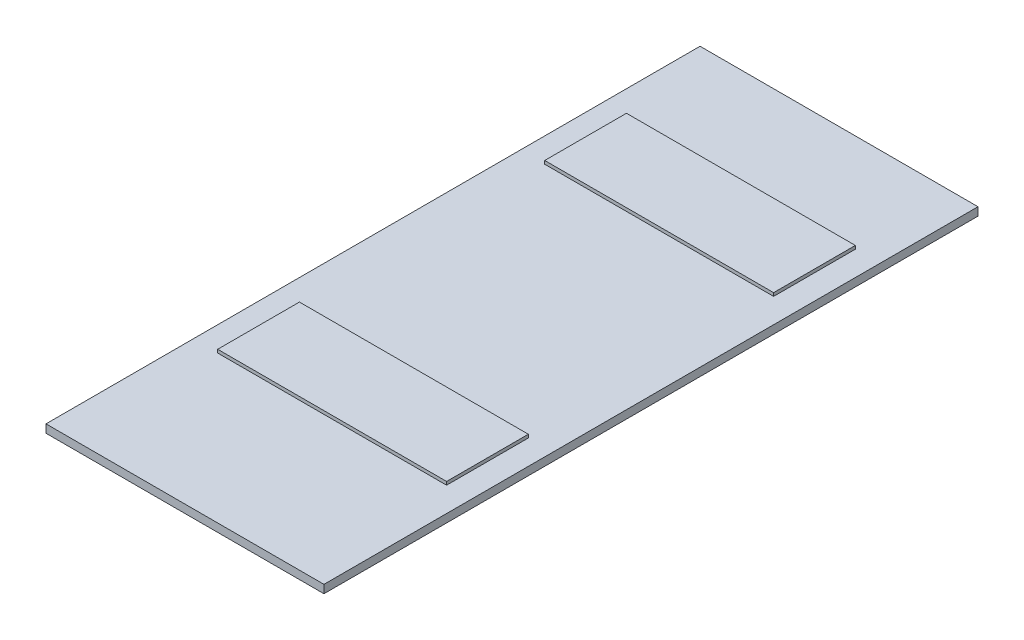
ISO-10303-21;
HEADER;
FILE_DESCRIPTION(('STEP AP214'),'2;1');
FILE_NAME('part.step','',(''),(''),'','','');
FILE_SCHEMA(('AUTOMOTIVE_DESIGN { 1 0 10303 214 1 1 1 1 }'));
ENDSEC;
DATA;
#1=APPLICATION_CONTEXT('core data for automotive mechanical design processes');
#2=APPLICATION_PROTOCOL_DEFINITION('international standard','automotive_design',2000,#1);
#3=PRODUCT_CONTEXT('',#1,'mechanical');
#4=PRODUCT('Part','Part','',(#3));
#5=PRODUCT_RELATED_PRODUCT_CATEGORY('part','',(#4));
#6=PRODUCT_DEFINITION_FORMATION('','',#4);
#7=PRODUCT_DEFINITION_CONTEXT('part definition',#1,'design');
#8=PRODUCT_DEFINITION('design','',#6,#7);
#9=PRODUCT_DEFINITION_SHAPE('','',#8);
#10=(LENGTH_UNIT() NAMED_UNIT(*) SI_UNIT(.MILLI.,.METRE.));
#11=(NAMED_UNIT(*) PLANE_ANGLE_UNIT() SI_UNIT($,.RADIAN.));
#12=(NAMED_UNIT(*) SI_UNIT($,.STERADIAN.) SOLID_ANGLE_UNIT());
#13=UNCERTAINTY_MEASURE_WITH_UNIT(LENGTH_MEASURE(1.E-05),#10,'distance_accuracy_value','');
#14=(GEOMETRIC_REPRESENTATION_CONTEXT(3) GLOBAL_UNCERTAINTY_ASSIGNED_CONTEXT((#13)) GLOBAL_UNIT_ASSIGNED_CONTEXT((#10,
#11,#12)) REPRESENTATION_CONTEXT('',''));
#15=CARTESIAN_POINT('',(0.,0.,0.));
#16=DIRECTION('',(0.,0.,1.));
#17=DIRECTION('',(1.,0.,0.));
#18=AXIS2_PLACEMENT_3D('',#15,#16,#17);
#19=CARTESIAN_POINT('',(0.,2.5,0.));
#20=DIRECTION('',(0.,-1.,0.));
#21=DIRECTION('',(0.,0.,-1.));
#22=AXIS2_PLACEMENT_3D('',#19,#20,#21);
#23=PLANE('',#22);
#24=DIRECTION('',(0.,0.,1.));
#25=VECTOR('',#24,1.);
#26=CARTESIAN_POINT('',(7.5,2.5,-170.));
#27=LINE('',#26,#25);
#28=CARTESIAN_POINT('',(7.5,2.5,-170.));
#29=VERTEX_POINT('',#28);
#30=CARTESIAN_POINT('',(7.5,2.5,-145.));
#31=VERTEX_POINT('',#30);
#32=EDGE_CURVE('E142',#29,#31,#27,.T.);
#33=ORIENTED_EDGE('',*,*,#32,.F.);
#34=DIRECTION('',(-1.,0.,0.));
#35=VECTOR('',#34,1.);
#36=CARTESIAN_POINT('',(7.5,2.5,-170.));
#37=LINE('',#36,#35);
#38=CARTESIAN_POINT('',(77.5,2.5,-170.));
#39=VERTEX_POINT('',#38);
#40=EDGE_CURVE('E155',#39,#29,#37,.T.);
#41=ORIENTED_EDGE('',*,*,#40,.F.);
#42=DIRECTION('',(0.,0.,-1.));
#43=VECTOR('',#42,1.);
#44=CARTESIAN_POINT('',(77.5,2.5,-170.));
#45=LINE('',#44,#43);
#46=CARTESIAN_POINT('',(77.5,2.5,-145.));
#47=VERTEX_POINT('',#46);
#48=EDGE_CURVE('E164',#47,#39,#45,.T.);
#49=ORIENTED_EDGE('',*,*,#48,.F.);
#50=DIRECTION('',(1.,0.,0.));
#51=VECTOR('',#50,1.);
#52=CARTESIAN_POINT('',(77.5,2.5,-145.));
#53=LINE('',#52,#51);
#54=EDGE_CURVE('E145',#31,#47,#53,.T.);
#55=ORIENTED_EDGE('',*,*,#54,.F.);
#56=EDGE_LOOP('',(#33,#41,#49,#55));
#57=FACE_BOUND('',#56,.T.);
#58=DIRECTION('',(0.,0.,1.));
#59=VECTOR('',#58,1.);
#60=CARTESIAN_POINT('',(0.,2.5,0.));
#61=LINE('',#60,#59);
#62=CARTESIAN_POINT('',(0.,2.5,-200.));
#63=VERTEX_POINT('',#62);
#64=CARTESIAN_POINT('',(0.,2.5,0.));
#65=VERTEX_POINT('',#64);
#66=EDGE_CURVE('E181',#63,#65,#61,.T.);
#67=ORIENTED_EDGE('',*,*,#66,.T.);
#68=DIRECTION('',(1.,0.,0.));
#69=VECTOR('',#68,1.);
#70=CARTESIAN_POINT('',(0.,2.5,0.));
#71=LINE('',#70,#69);
#72=CARTESIAN_POINT('',(85.,2.5,0.));
#73=VERTEX_POINT('',#72);
#74=EDGE_CURVE('E184',#65,#73,#71,.T.);
#75=ORIENTED_EDGE('',*,*,#74,.T.);
#76=DIRECTION('',(0.,0.,-1.));
#77=VECTOR('',#76,1.);
#78=CARTESIAN_POINT('',(85.,2.5,0.));
#79=LINE('',#78,#77);
#80=CARTESIAN_POINT('',(85.,2.5,-200.));
#81=VERTEX_POINT('',#80);
#82=EDGE_CURVE('E187',#73,#81,#79,.T.);
#83=ORIENTED_EDGE('',*,*,#82,.T.);
#84=DIRECTION('',(-1.,0.,0.));
#85=VECTOR('',#84,1.);
#86=CARTESIAN_POINT('',(0.,2.5,-200.));
#87=LINE('',#86,#85);
#88=EDGE_CURVE('E189',#81,#63,#87,.T.);
#89=ORIENTED_EDGE('',*,*,#88,.T.);
#90=EDGE_LOOP('',(#67,#75,#83,#89));
#91=FACE_BOUND('',#90,.T.);
#92=DIRECTION('',(0.,0.,1.));
#93=VECTOR('',#92,1.);
#94=CARTESIAN_POINT('',(7.5,2.5,-70.));
#95=LINE('',#94,#93);
#96=CARTESIAN_POINT('',(7.5,2.5,-70.));
#97=VERTEX_POINT('',#96);
#98=CARTESIAN_POINT('',(7.50000000000001,2.5,-45.));
#99=VERTEX_POINT('',#98);
#100=EDGE_CURVE('E141',#97,#99,#95,.T.);
#101=ORIENTED_EDGE('',*,*,#100,.F.);
#102=DIRECTION('',(-1.,0.,0.));
#103=VECTOR('',#102,1.);
#104=CARTESIAN_POINT('',(7.5,2.5,-70.));
#105=LINE('',#104,#103);
#106=CARTESIAN_POINT('',(77.5,2.5,-70.));
#107=VERTEX_POINT('',#106);
#108=EDGE_CURVE('E138',#107,#97,#105,.T.);
#109=ORIENTED_EDGE('',*,*,#108,.F.);
#110=DIRECTION('',(0.,0.,-1.));
#111=VECTOR('',#110,1.);
#112=CARTESIAN_POINT('',(77.5,2.5,-70.));
#113=LINE('',#112,#111);
#114=CARTESIAN_POINT('',(77.5,2.5,-45.));
#115=VERTEX_POINT('',#114);
#116=EDGE_CURVE('E52',#115,#107,#113,.T.);
#117=ORIENTED_EDGE('',*,*,#116,.F.);
#118=DIRECTION('',(1.,0.,0.));
#119=VECTOR('',#118,1.);
#120=CARTESIAN_POINT('',(77.5,2.5,-45.));
#121=LINE('',#120,#119);
#122=EDGE_CURVE('E47',#99,#115,#121,.T.);
#123=ORIENTED_EDGE('',*,*,#122,.F.);
#124=EDGE_LOOP('',(#101,#109,#117,#123));
#125=FACE_BOUND('',#124,.T.);
#126=ADVANCED_FACE('F32',(#57,#91,#125),#23,.F.);
#127=CARTESIAN_POINT('',(0.,2.5,0.));
#128=DIRECTION('',(1.,0.,0.));
#129=DIRECTION('',(0.,0.,-1.));
#130=AXIS2_PLACEMENT_3D('',#127,#128,#129);
#131=PLANE('',#130);
#132=DIRECTION('',(0.,0.,1.));
#133=VECTOR('',#132,1.);
#134=CARTESIAN_POINT('',(0.,0.,0.));
#135=LINE('',#134,#133);
#136=CARTESIAN_POINT('',(0.,0.,-200.));
#137=VERTEX_POINT('',#136);
#138=CARTESIAN_POINT('',(0.,0.,0.));
#139=VERTEX_POINT('',#138);
#140=EDGE_CURVE('E180',#137,#139,#135,.T.);
#141=ORIENTED_EDGE('',*,*,#140,.T.);
#142=DIRECTION('',(0.,-1.,0.));
#143=VECTOR('',#142,1.);
#144=CARTESIAN_POINT('',(0.,2.5,0.));
#145=LINE('',#144,#143);
#146=EDGE_CURVE('E11',#65,#139,#145,.T.);
#147=ORIENTED_EDGE('',*,*,#146,.F.);
#148=ORIENTED_EDGE('',*,*,#66,.F.);
#149=DIRECTION('',(0.,-1.,0.));
#150=VECTOR('',#149,1.);
#151=CARTESIAN_POINT('',(0.,2.5,-200.));
#152=LINE('',#151,#150);
#153=EDGE_CURVE('E191',#63,#137,#152,.T.);
#154=ORIENTED_EDGE('',*,*,#153,.T.);
#155=EDGE_LOOP('',(#141,#147,#148,#154));
#156=FACE_BOUND('',#155,.T.);
#157=ADVANCED_FACE('F34',(#156),#131,.F.);
#158=CARTESIAN_POINT('',(0.,2.5,0.));
#159=DIRECTION('',(0.,0.,-1.));
#160=DIRECTION('',(-1.,0.,0.));
#161=AXIS2_PLACEMENT_3D('',#158,#159,#160);
#162=PLANE('',#161);
#163=DIRECTION('',(1.,0.,0.));
#164=VECTOR('',#163,1.);
#165=CARTESIAN_POINT('',(0.,0.,0.));
#166=LINE('',#165,#164);
#167=CARTESIAN_POINT('',(85.,0.,0.));
#168=VERTEX_POINT('',#167);
#169=EDGE_CURVE('E194',#139,#168,#166,.T.);
#170=ORIENTED_EDGE('',*,*,#169,.T.);
#171=DIRECTION('',(0.,-1.,0.));
#172=VECTOR('',#171,1.);
#173=CARTESIAN_POINT('',(85.,2.5,0.));
#174=LINE('',#173,#172);
#175=EDGE_CURVE('E40',#73,#168,#174,.T.);
#176=ORIENTED_EDGE('',*,*,#175,.F.);
#177=ORIENTED_EDGE('',*,*,#74,.F.);
#178=ORIENTED_EDGE('',*,*,#146,.T.);
#179=EDGE_LOOP('',(#170,#176,#177,#178));
#180=FACE_BOUND('',#179,.T.);
#181=ADVANCED_FACE('F223',(#180),#162,.F.);
#182=CARTESIAN_POINT('',(85.,2.5,0.));
#183=DIRECTION('',(-1.,0.,0.));
#184=DIRECTION('',(0.,0.,1.));
#185=AXIS2_PLACEMENT_3D('',#182,#183,#184);
#186=PLANE('',#185);
#187=DIRECTION('',(0.,0.,-1.));
#188=VECTOR('',#187,1.);
#189=CARTESIAN_POINT('',(85.,0.,0.));
#190=LINE('',#189,#188);
#191=CARTESIAN_POINT('',(85.,0.,-200.));
#192=VERTEX_POINT('',#191);
#193=EDGE_CURVE('E196',#168,#192,#190,.T.);
#194=ORIENTED_EDGE('',*,*,#193,.T.);
#195=DIRECTION('',(0.,-1.,0.));
#196=VECTOR('',#195,1.);
#197=CARTESIAN_POINT('',(85.,2.5,-200.));
#198=LINE('',#197,#196);
#199=EDGE_CURVE('E201',#81,#192,#198,.T.);
#200=ORIENTED_EDGE('',*,*,#199,.F.);
#201=ORIENTED_EDGE('',*,*,#82,.F.);
#202=ORIENTED_EDGE('',*,*,#175,.T.);
#203=EDGE_LOOP('',(#194,#200,#201,#202));
#204=FACE_BOUND('',#203,.T.);
#205=ADVANCED_FACE('F208',(#204),#186,.F.);
#206=CARTESIAN_POINT('',(0.,2.5,-200.));
#207=DIRECTION('',(0.,0.,1.));
#208=DIRECTION('',(1.,0.,0.));
#209=AXIS2_PLACEMENT_3D('',#206,#207,#208);
#210=PLANE('',#209);
#211=DIRECTION('',(-1.,0.,0.));
#212=VECTOR('',#211,1.);
#213=CARTESIAN_POINT('',(0.,0.,-200.));
#214=LINE('',#213,#212);
#215=EDGE_CURVE('E185',#192,#137,#214,.T.);
#216=ORIENTED_EDGE('',*,*,#215,.T.);
#217=ORIENTED_EDGE('',*,*,#153,.F.);
#218=ORIENTED_EDGE('',*,*,#88,.F.);
#219=ORIENTED_EDGE('',*,*,#199,.T.);
#220=EDGE_LOOP('',(#216,#217,#218,#219));
#221=FACE_BOUND('',#220,.T.);
#222=ADVANCED_FACE('F217',(#221),#210,.F.);
#223=CARTESIAN_POINT('',(0.,0.,0.));
#224=DIRECTION('',(0.,-1.,0.));
#225=DIRECTION('',(0.,0.,-1.));
#226=AXIS2_PLACEMENT_3D('',#223,#224,#225);
#227=PLANE('',#226);
#228=ORIENTED_EDGE('',*,*,#140,.F.);
#229=ORIENTED_EDGE('',*,*,#215,.F.);
#230=ORIENTED_EDGE('',*,*,#193,.F.);
#231=ORIENTED_EDGE('',*,*,#169,.F.);
#232=EDGE_LOOP('',(#228,#229,#230,#231));
#233=FACE_BOUND('',#232,.T.);
#234=ADVANCED_FACE('F214',(#233),#227,.T.);
#235=CARTESIAN_POINT('',(7.5,3.5,-170.));
#236=DIRECTION('',(1.,0.,0.));
#237=DIRECTION('',(0.,0.,-1.));
#238=AXIS2_PLACEMENT_3D('',#235,#236,#237);
#239=PLANE('',#238);
#240=ORIENTED_EDGE('',*,*,#32,.T.);
#241=DIRECTION('',(0.,-1.,0.));
#242=VECTOR('',#241,1.);
#243=CARTESIAN_POINT('',(7.5,3.5,-145.));
#244=LINE('',#243,#242);
#245=CARTESIAN_POINT('',(7.5,3.5,-145.));
#246=VERTEX_POINT('',#245);
#247=EDGE_CURVE('E177',#246,#31,#244,.T.);
#248=ORIENTED_EDGE('',*,*,#247,.F.);
#249=DIRECTION('',(0.,0.,1.));
#250=VECTOR('',#249,1.);
#251=CARTESIAN_POINT('',(7.5,3.5,-170.));
#252=LINE('',#251,#250);
#253=CARTESIAN_POINT('',(7.5,3.5,-170.));
#254=VERTEX_POINT('',#253);
#255=EDGE_CURVE('E151',#254,#246,#252,.T.);
#256=ORIENTED_EDGE('',*,*,#255,.F.);
#257=DIRECTION('',(0.,-1.,0.));
#258=VECTOR('',#257,1.);
#259=CARTESIAN_POINT('',(7.5,3.5,-170.));
#260=LINE('',#259,#258);
#261=EDGE_CURVE('E160',#254,#29,#260,.T.);
#262=ORIENTED_EDGE('',*,*,#261,.T.);
#263=EDGE_LOOP('',(#240,#248,#256,#262));
#264=FACE_BOUND('',#263,.T.);
#265=ADVANCED_FACE('F237',(#264),#239,.F.);
#266=CARTESIAN_POINT('',(77.5,3.5,-145.));
#267=DIRECTION('',(0.,0.,-1.));
#268=DIRECTION('',(-1.,0.,0.));
#269=AXIS2_PLACEMENT_3D('',#266,#267,#268);
#270=PLANE('',#269);
#271=ORIENTED_EDGE('',*,*,#54,.T.);
#272=DIRECTION('',(0.,-1.,0.));
#273=VECTOR('',#272,1.);
#274=CARTESIAN_POINT('',(77.5,3.5,-145.));
#275=LINE('',#274,#273);
#276=CARTESIAN_POINT('',(77.5,3.5,-145.));
#277=VERTEX_POINT('',#276);
#278=EDGE_CURVE('E174',#277,#47,#275,.T.);
#279=ORIENTED_EDGE('',*,*,#278,.F.);
#280=DIRECTION('',(1.,0.,0.));
#281=VECTOR('',#280,1.);
#282=CARTESIAN_POINT('',(77.5,3.5,-145.));
#283=LINE('',#282,#281);
#284=EDGE_CURVE('E154',#246,#277,#283,.T.);
#285=ORIENTED_EDGE('',*,*,#284,.F.);
#286=ORIENTED_EDGE('',*,*,#247,.T.);
#287=EDGE_LOOP('',(#271,#279,#285,#286));
#288=FACE_BOUND('',#287,.T.);
#289=ADVANCED_FACE('F256',(#288),#270,.F.);
#290=CARTESIAN_POINT('',(77.5,3.5,-170.));
#291=DIRECTION('',(-1.,0.,0.));
#292=DIRECTION('',(0.,0.,1.));
#293=AXIS2_PLACEMENT_3D('',#290,#291,#292);
#294=PLANE('',#293);
#295=ORIENTED_EDGE('',*,*,#48,.T.);
#296=DIRECTION('',(0.,-1.,0.));
#297=VECTOR('',#296,1.);
#298=CARTESIAN_POINT('',(77.5,3.5,-170.));
#299=LINE('',#298,#297);
#300=CARTESIAN_POINT('',(77.5,3.5,-170.));
#301=VERTEX_POINT('',#300);
#302=EDGE_CURVE('E171',#301,#39,#299,.T.);
#303=ORIENTED_EDGE('',*,*,#302,.F.);
#304=DIRECTION('',(0.,0.,-1.));
#305=VECTOR('',#304,1.);
#306=CARTESIAN_POINT('',(77.5,3.5,-170.));
#307=LINE('',#306,#305);
#308=EDGE_CURVE('E157',#277,#301,#307,.T.);
#309=ORIENTED_EDGE('',*,*,#308,.F.);
#310=ORIENTED_EDGE('',*,*,#278,.T.);
#311=EDGE_LOOP('',(#295,#303,#309,#310));
#312=FACE_BOUND('',#311,.T.);
#313=ADVANCED_FACE('F263',(#312),#294,.F.);
#314=CARTESIAN_POINT('',(7.5,3.5,-170.));
#315=DIRECTION('',(0.,0.,1.));
#316=DIRECTION('',(1.,0.,0.));
#317=AXIS2_PLACEMENT_3D('',#314,#315,#316);
#318=PLANE('',#317);
#319=ORIENTED_EDGE('',*,*,#40,.T.);
#320=ORIENTED_EDGE('',*,*,#261,.F.);
#321=DIRECTION('',(-1.,0.,0.));
#322=VECTOR('',#321,1.);
#323=CARTESIAN_POINT('',(7.5,3.5,-170.));
#324=LINE('',#323,#322);
#325=EDGE_CURVE('E159',#301,#254,#324,.T.);
#326=ORIENTED_EDGE('',*,*,#325,.F.);
#327=ORIENTED_EDGE('',*,*,#302,.T.);
#328=EDGE_LOOP('',(#319,#320,#326,#327));
#329=FACE_BOUND('',#328,.T.);
#330=ADVANCED_FACE('F270',(#329),#318,.F.);
#331=CARTESIAN_POINT('',(0.,3.5,0.));
#332=DIRECTION('',(0.,-1.,0.));
#333=DIRECTION('',(0.,0.,-1.));
#334=AXIS2_PLACEMENT_3D('',#331,#332,#333);
#335=PLANE('',#334);
#336=ORIENTED_EDGE('',*,*,#255,.T.);
#337=ORIENTED_EDGE('',*,*,#284,.T.);
#338=ORIENTED_EDGE('',*,*,#308,.T.);
#339=ORIENTED_EDGE('',*,*,#325,.T.);
#340=EDGE_LOOP('',(#336,#337,#338,#339));
#341=FACE_BOUND('',#340,.T.);
#342=ADVANCED_FACE('F278',(#341),#335,.F.);
#343=CARTESIAN_POINT('',(7.5,3.5,-70.));
#344=DIRECTION('',(1.,0.,0.));
#345=DIRECTION('',(0.,0.,-1.));
#346=AXIS2_PLACEMENT_3D('',#343,#344,#345);
#347=PLANE('',#346);
#348=ORIENTED_EDGE('',*,*,#100,.T.);
#349=DIRECTION('',(0.,-1.,0.));
#350=VECTOR('',#349,1.);
#351=CARTESIAN_POINT('',(7.50000000000001,3.5,-45.));
#352=LINE('',#351,#350);
#353=CARTESIAN_POINT('',(7.50000000000001,3.5,-45.));
#354=VERTEX_POINT('',#353);
#355=EDGE_CURVE('E122',#354,#99,#352,.T.);
#356=ORIENTED_EDGE('',*,*,#355,.F.);
#357=DIRECTION('',(0.,0.,1.));
#358=VECTOR('',#357,1.);
#359=CARTESIAN_POINT('',(7.5,3.5,-70.));
#360=LINE('',#359,#358);
#361=CARTESIAN_POINT('',(7.5,3.5,-70.));
#362=VERTEX_POINT('',#361);
#363=EDGE_CURVE('E129',#362,#354,#360,.T.);
#364=ORIENTED_EDGE('',*,*,#363,.F.);
#365=DIRECTION('',(0.,-1.,0.));
#366=VECTOR('',#365,1.);
#367=CARTESIAN_POINT('',(7.5,3.5,-70.));
#368=LINE('',#367,#366);
#369=EDGE_CURVE('E367',#362,#97,#368,.T.);
#370=ORIENTED_EDGE('',*,*,#369,.T.);
#371=EDGE_LOOP('',(#348,#356,#364,#370));
#372=FACE_BOUND('',#371,.T.);
#373=ADVANCED_FACE('F140',(#372),#347,.F.);
#374=CARTESIAN_POINT('',(77.5,3.5,-45.));
#375=DIRECTION('',(0.,0.,-1.));
#376=DIRECTION('',(-1.,0.,0.));
#377=AXIS2_PLACEMENT_3D('',#374,#375,#376);
#378=PLANE('',#377);
#379=ORIENTED_EDGE('',*,*,#122,.T.);
#380=DIRECTION('',(0.,-1.,0.));
#381=VECTOR('',#380,1.);
#382=CARTESIAN_POINT('',(77.5,3.5,-45.));
#383=LINE('',#382,#381);
#384=CARTESIAN_POINT('',(77.5,3.5,-45.));
#385=VERTEX_POINT('',#384);
#386=EDGE_CURVE('E125',#385,#115,#383,.T.);
#387=ORIENTED_EDGE('',*,*,#386,.F.);
#388=DIRECTION('',(1.,0.,0.));
#389=VECTOR('',#388,1.);
#390=CARTESIAN_POINT('',(77.5,3.5,-45.));
#391=LINE('',#390,#389);
#392=EDGE_CURVE('E118',#354,#385,#391,.T.);
#393=ORIENTED_EDGE('',*,*,#392,.F.);
#394=ORIENTED_EDGE('',*,*,#355,.T.);
#395=EDGE_LOOP('',(#379,#387,#393,#394));
#396=FACE_BOUND('',#395,.T.);
#397=ADVANCED_FACE('F120',(#396),#378,.F.);
#398=CARTESIAN_POINT('',(77.5,3.5,-70.));
#399=DIRECTION('',(-1.,0.,0.));
#400=DIRECTION('',(0.,0.,1.));
#401=AXIS2_PLACEMENT_3D('',#398,#399,#400);
#402=PLANE('',#401);
#403=ORIENTED_EDGE('',*,*,#116,.T.);
#404=DIRECTION('',(0.,-1.,0.));
#405=VECTOR('',#404,1.);
#406=CARTESIAN_POINT('',(77.5,3.5,-70.));
#407=LINE('',#406,#405);
#408=CARTESIAN_POINT('',(77.5,3.5,-70.));
#409=VERTEX_POINT('',#408);
#410=EDGE_CURVE('E147',#409,#107,#407,.T.);
#411=ORIENTED_EDGE('',*,*,#410,.F.);
#412=DIRECTION('',(0.,0.,-1.));
#413=VECTOR('',#412,1.);
#414=CARTESIAN_POINT('',(77.5,3.5,-70.));
#415=LINE('',#414,#413);
#416=EDGE_CURVE('E128',#385,#409,#415,.T.);
#417=ORIENTED_EDGE('',*,*,#416,.F.);
#418=ORIENTED_EDGE('',*,*,#386,.T.);
#419=EDGE_LOOP('',(#403,#411,#417,#418));
#420=FACE_BOUND('',#419,.T.);
#421=ADVANCED_FACE('F299',(#420),#402,.F.);
#422=CARTESIAN_POINT('',(7.5,3.5,-70.));
#423=DIRECTION('',(0.,0.,1.));
#424=DIRECTION('',(1.,0.,0.));
#425=AXIS2_PLACEMENT_3D('',#422,#423,#424);
#426=PLANE('',#425);
#427=ORIENTED_EDGE('',*,*,#108,.T.);
#428=ORIENTED_EDGE('',*,*,#369,.F.);
#429=DIRECTION('',(-1.,0.,0.));
#430=VECTOR('',#429,1.);
#431=CARTESIAN_POINT('',(7.5,3.5,-70.));
#432=LINE('',#431,#430);
#433=EDGE_CURVE('E134',#409,#362,#432,.T.);
#434=ORIENTED_EDGE('',*,*,#433,.F.);
#435=ORIENTED_EDGE('',*,*,#410,.T.);
#436=EDGE_LOOP('',(#427,#428,#434,#435));
#437=FACE_BOUND('',#436,.T.);
#438=ADVANCED_FACE('F306',(#437),#426,.F.);
#439=CARTESIAN_POINT('',(0.,3.5,0.));
#440=DIRECTION('',(0.,-1.,0.));
#441=DIRECTION('',(0.,0.,-1.));
#442=AXIS2_PLACEMENT_3D('',#439,#440,#441);
#443=PLANE('',#442);
#444=ORIENTED_EDGE('',*,*,#363,.T.);
#445=ORIENTED_EDGE('',*,*,#392,.T.);
#446=ORIENTED_EDGE('',*,*,#416,.T.);
#447=ORIENTED_EDGE('',*,*,#433,.T.);
#448=EDGE_LOOP('',(#444,#445,#446,#447));
#449=FACE_BOUND('',#448,.T.);
#450=ADVANCED_FACE('F132',(#449),#443,.F.);
#451=CLOSED_SHELL('',(#126,#157,#181,#205,#222,#234,#265,#289,#313,#330,#342,#373,#397,#421,
#438,#450));
#452=MANIFOLD_SOLID_BREP('B2',#451);
#453=ADVANCED_BREP_SHAPE_REPRESENTATION('',(#18,#452),#14);
#454=SHAPE_DEFINITION_REPRESENTATION(#9,#453);
ENDSEC;
END-ISO-10303-21;
